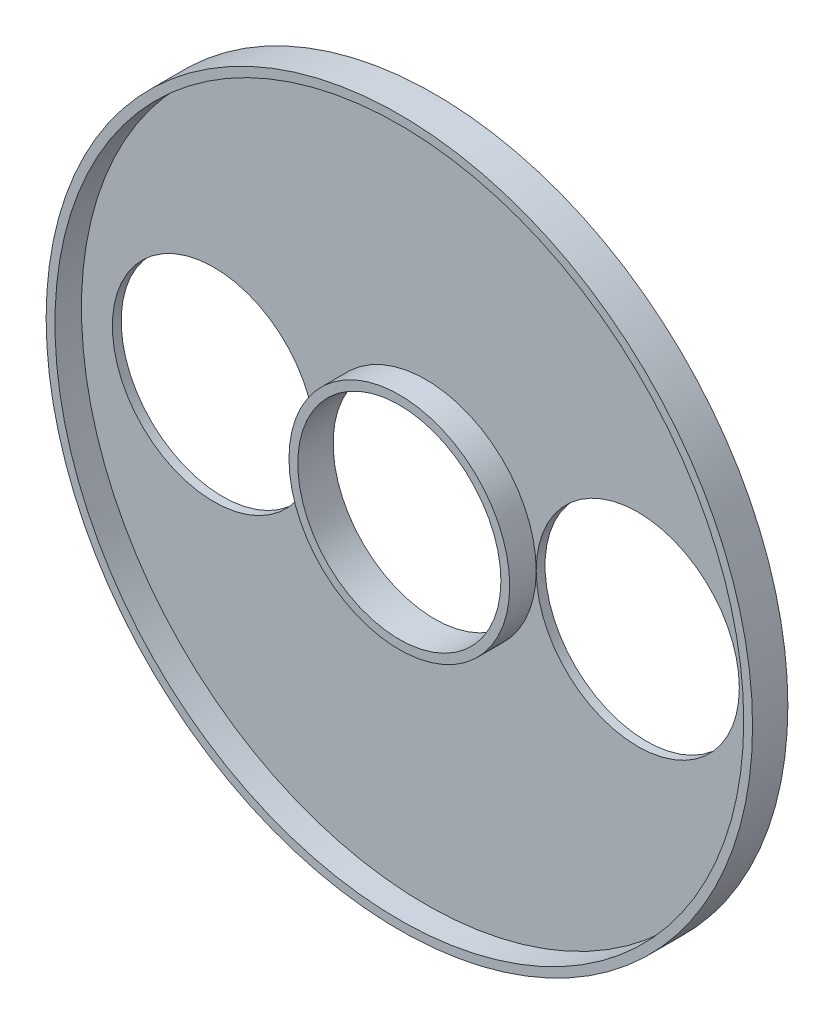
ISO-10303-21;
HEADER;
FILE_DESCRIPTION(('STEP AP214'),'2;1');
FILE_NAME('part.step','',(''),(''),'','','');
FILE_SCHEMA(('AUTOMOTIVE_DESIGN { 1 0 10303 214 1 1 1 1 }'));
ENDSEC;
DATA;
#1=APPLICATION_CONTEXT('core data for automotive mechanical design processes');
#2=APPLICATION_PROTOCOL_DEFINITION('international standard','automotive_design',2000,#1);
#3=PRODUCT_CONTEXT('',#1,'mechanical');
#4=PRODUCT('Part','Part','',(#3));
#5=PRODUCT_RELATED_PRODUCT_CATEGORY('part','',(#4));
#6=PRODUCT_DEFINITION_FORMATION('','',#4);
#7=PRODUCT_DEFINITION_CONTEXT('part definition',#1,'design');
#8=PRODUCT_DEFINITION('design','',#6,#7);
#9=PRODUCT_DEFINITION_SHAPE('','',#8);
#10=(LENGTH_UNIT() NAMED_UNIT(*) SI_UNIT(.MILLI.,.METRE.));
#11=(NAMED_UNIT(*) PLANE_ANGLE_UNIT() SI_UNIT($,.RADIAN.));
#12=(NAMED_UNIT(*) SI_UNIT($,.STERADIAN.) SOLID_ANGLE_UNIT());
#13=UNCERTAINTY_MEASURE_WITH_UNIT(LENGTH_MEASURE(1.E-05),#10,'distance_accuracy_value','');
#14=(GEOMETRIC_REPRESENTATION_CONTEXT(3) GLOBAL_UNCERTAINTY_ASSIGNED_CONTEXT((#13)) GLOBAL_UNIT_ASSIGNED_CONTEXT((#10,
#11,#12)) REPRESENTATION_CONTEXT('',''));
#15=CARTESIAN_POINT('',(0.,0.,0.));
#16=DIRECTION('',(0.,0.,1.));
#17=DIRECTION('',(1.,0.,0.));
#18=AXIS2_PLACEMENT_3D('',#15,#16,#17);
#19=CARTESIAN_POINT('',(0.,0.,-55.));
#20=DIRECTION('',(0.,0.,1.));
#21=DIRECTION('',(1.,0.,0.));
#22=AXIS2_PLACEMENT_3D('',#19,#20,#21);
#23=PLANE('',#22);
#24=CARTESIAN_POINT('',(0.,0.,-55.));
#25=DIRECTION('',(0.,0.,1.));
#26=DIRECTION('',(1.,0.,0.));
#27=AXIS2_PLACEMENT_3D('',#24,#25,#26);
#28=CIRCLE('',#27,78.);
#29=CARTESIAN_POINT('',(78.,0.,-55.));
#30=VERTEX_POINT('',#29);
#31=EDGE_CURVE('E11',#30,#30,#28,.F.);
#32=ORIENTED_EDGE('',*,*,#31,.F.);
#33=EDGE_LOOP('',(#32));
#34=FACE_BOUND('',#33,.T.);
#35=CARTESIAN_POINT('',(0.,0.,-55.));
#36=DIRECTION('',(0.,0.,1.));
#37=DIRECTION('',(1.,0.,0.));
#38=AXIS2_PLACEMENT_3D('',#35,#36,#37);
#39=CIRCLE('',#38,25.);
#40=CARTESIAN_POINT('',(25.,0.,-55.));
#41=VERTEX_POINT('',#40);
#42=CARTESIAN_POINT('',(-25.,0.,-55.));
#43=VERTEX_POINT('',#42);
#44=EDGE_CURVE('E87',#41,#43,#39,.F.);
#45=ORIENTED_EDGE('',*,*,#44,.T.);
#46=CARTESIAN_POINT('',(-48.,0.,-55.));
#47=DIRECTION('',(0.,0.,1.));
#48=DIRECTION('',(1.,0.,0.));
#49=AXIS2_PLACEMENT_3D('',#46,#47,#48);
#50=CIRCLE('',#49,23.);
#51=EDGE_CURVE('E53',#43,#43,#50,.T.);
#52=ORIENTED_EDGE('',*,*,#51,.F.);
#53=EDGE_CURVE('E86',#43,#41,#39,.F.);
#54=ORIENTED_EDGE('',*,*,#53,.T.);
#55=CARTESIAN_POINT('',(48.,0.,-55.));
#56=DIRECTION('',(0.,0.,1.));
#57=DIRECTION('',(1.,0.,0.));
#58=AXIS2_PLACEMENT_3D('',#55,#56,#57);
#59=CIRCLE('',#58,23.);
#60=EDGE_CURVE('E57',#41,#41,#59,.T.);
#61=ORIENTED_EDGE('',*,*,#60,.F.);
#62=EDGE_LOOP('',(#45,#52,#54,#61));
#63=FACE_BOUND('',#62,.T.);
#64=ADVANCED_FACE('F38',(#34,#63),#23,.T.);
#65=CARTESIAN_POINT('',(0.,0.,-57.));
#66=DIRECTION('',(0.,0.,1.));
#67=DIRECTION('',(1.,0.,0.));
#68=AXIS2_PLACEMENT_3D('',#65,#66,#67);
#69=PLANE('',#68);
#70=CARTESIAN_POINT('',(-48.,0.,-57.));
#71=DIRECTION('',(0.,0.,1.));
#72=DIRECTION('',(1.,0.,0.));
#73=AXIS2_PLACEMENT_3D('',#70,#71,#72);
#74=CIRCLE('',#73,23.);
#75=CARTESIAN_POINT('',(-25.,0.,-57.));
#76=VERTEX_POINT('',#75);
#77=EDGE_CURVE('E74',#76,#76,#74,.T.);
#78=ORIENTED_EDGE('',*,*,#77,.T.);
#79=EDGE_LOOP('',(#78));
#80=FACE_BOUND('',#79,.T.);
#81=CARTESIAN_POINT('',(48.,0.,-57.));
#82=DIRECTION('',(0.,0.,1.));
#83=DIRECTION('',(1.,0.,0.));
#84=AXIS2_PLACEMENT_3D('',#81,#82,#83);
#85=CIRCLE('',#84,23.);
#86=CARTESIAN_POINT('',(71.,0.,-57.));
#87=VERTEX_POINT('',#86);
#88=EDGE_CURVE('E64',#87,#87,#85,.T.);
#89=ORIENTED_EDGE('',*,*,#88,.T.);
#90=EDGE_LOOP('',(#89));
#91=FACE_BOUND('',#90,.T.);
#92=CARTESIAN_POINT('',(0.,0.,-57.));
#93=DIRECTION('',(0.,0.,1.));
#94=DIRECTION('',(1.,0.,0.));
#95=AXIS2_PLACEMENT_3D('',#92,#93,#94);
#96=CIRCLE('',#95,23.);
#97=CARTESIAN_POINT('',(23.,0.,-57.));
#98=VERTEX_POINT('',#97);
#99=EDGE_CURVE('E95',#98,#98,#96,.T.);
#100=ORIENTED_EDGE('',*,*,#99,.T.);
#101=EDGE_LOOP('',(#100));
#102=FACE_BOUND('',#101,.T.);
#103=CARTESIAN_POINT('',(0.,0.,-57.));
#104=DIRECTION('',(0.,0.,1.));
#105=DIRECTION('',(1.,0.,0.));
#106=AXIS2_PLACEMENT_3D('',#103,#104,#105);
#107=CIRCLE('',#106,80.);
#108=CARTESIAN_POINT('',(80.,0.,-57.));
#109=VERTEX_POINT('',#108);
#110=EDGE_CURVE('E42',#109,#109,#107,.T.);
#111=ORIENTED_EDGE('',*,*,#110,.F.);
#112=EDGE_LOOP('',(#111));
#113=FACE_BOUND('',#112,.T.);
#114=ADVANCED_FACE('F106',(#80,#91,#102,#113),#69,.F.);
#115=CARTESIAN_POINT('',(0.,0.,-55.));
#116=DIRECTION('',(0.,0.,-1.));
#117=DIRECTION('',(-1.,0.,0.));
#118=AXIS2_PLACEMENT_3D('',#115,#116,#117);
#119=CYLINDRICAL_SURFACE('',#118,80.);
#120=ORIENTED_EDGE('',*,*,#110,.T.);
#121=EDGE_LOOP('',(#120));
#122=FACE_BOUND('',#121,.T.);
#123=CARTESIAN_POINT('',(0.,0.,-49.));
#124=DIRECTION('',(0.,0.,1.));
#125=DIRECTION('',(1.,0.,0.));
#126=AXIS2_PLACEMENT_3D('',#123,#124,#125);
#127=CIRCLE('',#126,80.);
#128=CARTESIAN_POINT('',(80.,0.,-49.));
#129=VERTEX_POINT('',#128);
#130=EDGE_CURVE('E93',#129,#129,#127,.T.);
#131=ORIENTED_EDGE('',*,*,#130,.F.);
#132=EDGE_LOOP('',(#131));
#133=FACE_BOUND('',#132,.T.);
#134=ADVANCED_FACE('F40',(#122,#133),#119,.T.);
#135=CARTESIAN_POINT('',(0.,0.,-55.));
#136=DIRECTION('',(0.,0.,-1.));
#137=DIRECTION('',(-1.,0.,0.));
#138=AXIS2_PLACEMENT_3D('',#135,#136,#137);
#139=CYLINDRICAL_SURFACE('',#138,23.);
#140=ORIENTED_EDGE('',*,*,#99,.F.);
#141=EDGE_LOOP('',(#140));
#142=FACE_BOUND('',#141,.T.);
#143=CARTESIAN_POINT('',(0.,0.,-49.));
#144=DIRECTION('',(0.,0.,1.));
#145=DIRECTION('',(1.,0.,0.));
#146=AXIS2_PLACEMENT_3D('',#143,#144,#145);
#147=CIRCLE('',#146,23.);
#148=CARTESIAN_POINT('',(23.,0.,-49.));
#149=VERTEX_POINT('',#148);
#150=EDGE_CURVE('E78',#149,#149,#147,.T.);
#151=ORIENTED_EDGE('',*,*,#150,.T.);
#152=EDGE_LOOP('',(#151));
#153=FACE_BOUND('',#152,.T.);
#154=ADVANCED_FACE('F113',(#142,#153),#139,.F.);
#155=CARTESIAN_POINT('',(0.,0.,-49.));
#156=DIRECTION('',(0.,0.,1.));
#157=DIRECTION('',(1.,0.,0.));
#158=AXIS2_PLACEMENT_3D('',#155,#156,#157);
#159=PLANE('',#158);
#160=ORIENTED_EDGE('',*,*,#130,.T.);
#161=EDGE_LOOP('',(#160));
#162=FACE_BOUND('',#161,.T.);
#163=CARTESIAN_POINT('',(0.,0.,-49.));
#164=DIRECTION('',(0.,0.,1.));
#165=DIRECTION('',(1.,0.,0.));
#166=AXIS2_PLACEMENT_3D('',#163,#164,#165);
#167=CIRCLE('',#166,78.);
#168=CARTESIAN_POINT('',(78.,0.,-49.));
#169=VERTEX_POINT('',#168);
#170=EDGE_CURVE('E89',#169,#169,#167,.T.);
#171=ORIENTED_EDGE('',*,*,#170,.F.);
#172=EDGE_LOOP('',(#171));
#173=FACE_BOUND('',#172,.T.);
#174=ADVANCED_FACE('F120',(#162,#173),#159,.T.);
#175=CARTESIAN_POINT('',(0.,0.,-49.));
#176=DIRECTION('',(0.,0.,-1.));
#177=DIRECTION('',(-1.,0.,0.));
#178=AXIS2_PLACEMENT_3D('',#175,#176,#177);
#179=CYLINDRICAL_SURFACE('',#178,78.);
#180=ORIENTED_EDGE('',*,*,#31,.T.);
#181=EDGE_LOOP('',(#180));
#182=FACE_BOUND('',#181,.T.);
#183=ORIENTED_EDGE('',*,*,#170,.T.);
#184=EDGE_LOOP('',(#183));
#185=FACE_BOUND('',#184,.T.);
#186=ADVANCED_FACE('F124',(#182,#185),#179,.F.);
#187=CARTESIAN_POINT('',(0.,0.,-49.));
#188=DIRECTION('',(0.,0.,1.));
#189=DIRECTION('',(1.,0.,0.));
#190=AXIS2_PLACEMENT_3D('',#187,#188,#189);
#191=PLANE('',#190);
#192=CARTESIAN_POINT('',(0.,0.,-49.));
#193=DIRECTION('',(0.,0.,1.));
#194=DIRECTION('',(1.,0.,0.));
#195=AXIS2_PLACEMENT_3D('',#192,#193,#194);
#196=CIRCLE('',#195,25.);
#197=CARTESIAN_POINT('',(25.,0.,-49.));
#198=VERTEX_POINT('',#197);
#199=EDGE_CURVE('E82',#198,#198,#196,.T.);
#200=ORIENTED_EDGE('',*,*,#199,.T.);
#201=EDGE_LOOP('',(#200));
#202=FACE_BOUND('',#201,.T.);
#203=ORIENTED_EDGE('',*,*,#150,.F.);
#204=EDGE_LOOP('',(#203));
#205=FACE_BOUND('',#204,.T.);
#206=ADVANCED_FACE('F128',(#202,#205),#191,.T.);
#207=CARTESIAN_POINT('',(0.,0.,-49.));
#208=DIRECTION('',(0.,0.,-1.));
#209=DIRECTION('',(-1.,0.,0.));
#210=AXIS2_PLACEMENT_3D('',#207,#208,#209);
#211=CYLINDRICAL_SURFACE('',#210,25.);
#212=ORIENTED_EDGE('',*,*,#199,.F.);
#213=EDGE_LOOP('',(#212));
#214=FACE_BOUND('',#213,.T.);
#215=ORIENTED_EDGE('',*,*,#53,.F.);
#216=ORIENTED_EDGE('',*,*,#44,.F.);
#217=EDGE_LOOP('',(#215,#216));
#218=FACE_BOUND('',#217,.T.);
#219=ADVANCED_FACE('F130',(#214,#218),#211,.T.);
#220=CARTESIAN_POINT('',(48.,0.,-100.));
#221=DIRECTION('',(0.,0.,1.));
#222=DIRECTION('',(1.,0.,0.));
#223=AXIS2_PLACEMENT_3D('',#220,#221,#222);
#224=CYLINDRICAL_SURFACE('',#223,23.);
#225=ORIENTED_EDGE('',*,*,#60,.T.);
#226=EDGE_LOOP('',(#225));
#227=FACE_BOUND('',#226,.T.);
#228=ORIENTED_EDGE('',*,*,#88,.F.);
#229=EDGE_LOOP('',(#228));
#230=FACE_BOUND('',#229,.T.);
#231=ADVANCED_FACE('F58',(#227,#230),#224,.F.);
#232=CARTESIAN_POINT('',(-48.,0.,-100.));
#233=DIRECTION('',(0.,0.,1.));
#234=DIRECTION('',(1.,0.,0.));
#235=AXIS2_PLACEMENT_3D('',#232,#233,#234);
#236=CYLINDRICAL_SURFACE('',#235,23.);
#237=ORIENTED_EDGE('',*,*,#51,.T.);
#238=EDGE_LOOP('',(#237));
#239=FACE_BOUND('',#238,.T.);
#240=ORIENTED_EDGE('',*,*,#77,.F.);
#241=EDGE_LOOP('',(#240));
#242=FACE_BOUND('',#241,.T.);
#243=ADVANCED_FACE('F139',(#239,#242),#236,.F.);
#244=CLOSED_SHELL('',(#64,#114,#134,#154,#174,#186,#206,#219,#231,#243));
#245=MANIFOLD_SOLID_BREP('B2',#244);
#246=ADVANCED_BREP_SHAPE_REPRESENTATION('',(#18,#245),#14);
#247=SHAPE_DEFINITION_REPRESENTATION(#9,#246);
ENDSEC;
END-ISO-10303-21;
